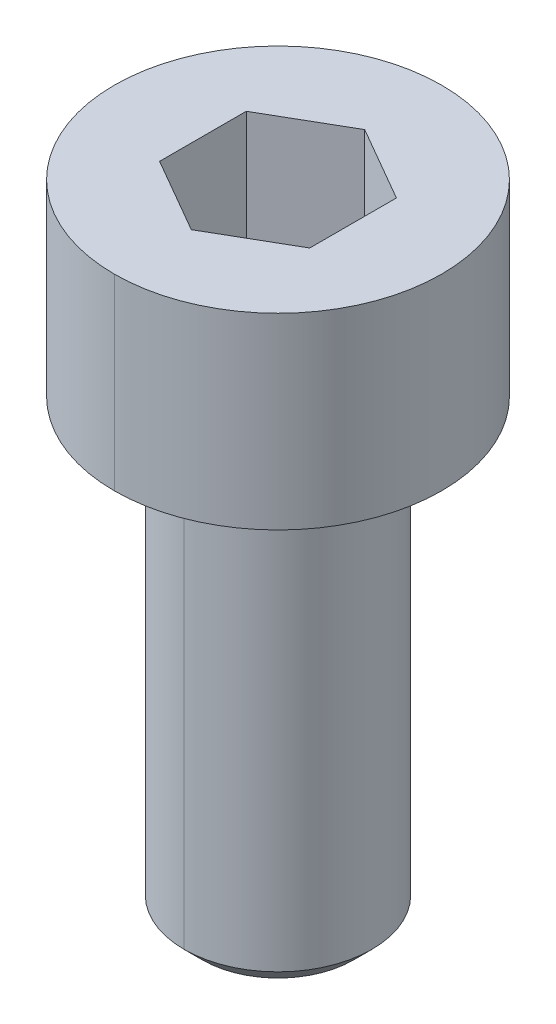
ISO-10303-21;
HEADER;
FILE_DESCRIPTION(('STEP AP214'),'2;1');
FILE_NAME('part.step','',(''),(''),'','','');
FILE_SCHEMA(('AUTOMOTIVE_DESIGN { 1 0 10303 214 1 1 1 1 }'));
ENDSEC;
DATA;
#1=APPLICATION_CONTEXT('core data for automotive mechanical design processes');
#2=APPLICATION_PROTOCOL_DEFINITION('international standard','automotive_design',2000,#1);
#3=PRODUCT_CONTEXT('',#1,'mechanical');
#4=PRODUCT('Part','Part','',(#3));
#5=PRODUCT_RELATED_PRODUCT_CATEGORY('part','',(#4));
#6=PRODUCT_DEFINITION_FORMATION('','',#4);
#7=PRODUCT_DEFINITION_CONTEXT('part definition',#1,'design');
#8=PRODUCT_DEFINITION('design','',#6,#7);
#9=PRODUCT_DEFINITION_SHAPE('','',#8);
#10=(LENGTH_UNIT() NAMED_UNIT(*) SI_UNIT(.MILLI.,.METRE.));
#11=(NAMED_UNIT(*) PLANE_ANGLE_UNIT() SI_UNIT($,.RADIAN.));
#12=(NAMED_UNIT(*) SI_UNIT($,.STERADIAN.) SOLID_ANGLE_UNIT());
#13=UNCERTAINTY_MEASURE_WITH_UNIT(LENGTH_MEASURE(1.E-05),#10,'distance_accuracy_value','');
#14=(GEOMETRIC_REPRESENTATION_CONTEXT(3) GLOBAL_UNCERTAINTY_ASSIGNED_CONTEXT((#13)) GLOBAL_UNIT_ASSIGNED_CONTEXT((#10,
#11,#12)) REPRESENTATION_CONTEXT('',''));
#15=CARTESIAN_POINT('',(0.,0.,0.));
#16=DIRECTION('',(0.,0.,1.));
#17=DIRECTION('',(1.,0.,0.));
#18=AXIS2_PLACEMENT_3D('',#15,#16,#17);
#19=CARTESIAN_POINT('',(0.,5.,0.));
#20=DIRECTION('',(0.,-1.,0.));
#21=DIRECTION('',(0.,0.,-1.));
#22=AXIS2_PLACEMENT_3D('',#19,#20,#21);
#23=PLANE('',#22);
#24=CARTESIAN_POINT('',(0.,5.,0.));
#25=DIRECTION('',(0.,-1.,0.));
#26=DIRECTION('',(0.,0.,-1.));
#27=AXIS2_PLACEMENT_3D('',#24,#25,#26);
#28=CIRCLE('',#27,4.36);
#29=CARTESIAN_POINT('',(0.,5.,-4.36));
#30=VERTEX_POINT('',#29);
#31=CARTESIAN_POINT('',(0.,5.,4.36));
#32=VERTEX_POINT('',#31);
#33=EDGE_CURVE('E11',#30,#32,#28,.T.);
#34=ORIENTED_EDGE('',*,*,#33,.F.);
#35=CARTESIAN_POINT('',(0.,5.,0.));
#36=DIRECTION('',(0.,-1.,0.));
#37=DIRECTION('',(0.,0.,-1.));
#38=AXIS2_PLACEMENT_3D('',#35,#36,#37);
#39=CIRCLE('',#38,4.36);
#40=EDGE_CURVE('E25',#32,#30,#39,.T.);
#41=ORIENTED_EDGE('',*,*,#40,.F.);
#42=EDGE_LOOP('',(#34,#41));
#43=FACE_BOUND('',#42,.T.);
#44=DIRECTION('',(0.866025403784448,0.,-0.499999999999983));
#45=VECTOR('',#44,1.);
#46=CARTESIAN_POINT('',(0.,5.,2.3094010767585));
#47=LINE('',#46,#45);
#48=CARTESIAN_POINT('',(0.,5.,2.3094010767585));
#49=VERTEX_POINT('',#48);
#50=CARTESIAN_POINT('',(2.,5.,1.1547005383793));
#51=VERTEX_POINT('',#50);
#52=EDGE_CURVE('E245',#49,#51,#47,.T.);
#53=ORIENTED_EDGE('',*,*,#52,.F.);
#54=DIRECTION('',(0.866025403784448,0.,0.499999999999983));
#55=VECTOR('',#54,1.);
#56=CARTESIAN_POINT('',(-2.,5.,1.1547005383793));
#57=LINE('',#56,#55);
#58=CARTESIAN_POINT('',(-2.,5.,1.1547005383793));
#59=VERTEX_POINT('',#58);
#60=EDGE_CURVE('E240',#59,#49,#57,.T.);
#61=ORIENTED_EDGE('',*,*,#60,.F.);
#62=DIRECTION('',(0.,0.,1.));
#63=VECTOR('',#62,1.);
#64=CARTESIAN_POINT('',(-2.,5.,-1.1547005383793));
#65=LINE('',#64,#63);
#66=CARTESIAN_POINT('',(-2.,5.,-1.1547005383793));
#67=VERTEX_POINT('',#66);
#68=EDGE_CURVE('E235',#67,#59,#65,.T.);
#69=ORIENTED_EDGE('',*,*,#68,.F.);
#70=DIRECTION('',(-0.866025403784448,0.,0.499999999999983));
#71=VECTOR('',#70,1.);
#72=CARTESIAN_POINT('',(0.,5.,-2.3094010767585));
#73=LINE('',#72,#71);
#74=CARTESIAN_POINT('',(0.,5.,-2.3094010767585));
#75=VERTEX_POINT('',#74);
#76=EDGE_CURVE('E230',#75,#67,#73,.T.);
#77=ORIENTED_EDGE('',*,*,#76,.F.);
#78=DIRECTION('',(-0.866025403784448,0.,-0.499999999999983));
#79=VECTOR('',#78,1.);
#80=CARTESIAN_POINT('',(2.,5.,-1.1547005383793));
#81=LINE('',#80,#79);
#82=CARTESIAN_POINT('',(2.,5.,-1.1547005383793));
#83=VERTEX_POINT('',#82);
#84=EDGE_CURVE('E225',#83,#75,#81,.T.);
#85=ORIENTED_EDGE('',*,*,#84,.F.);
#86=DIRECTION('',(0.,0.,1.));
#87=VECTOR('',#86,1.);
#88=CARTESIAN_POINT('',(2.,5.,0.));
#89=LINE('',#88,#87);
#90=EDGE_CURVE('E221',#83,#51,#89,.T.);
#91=ORIENTED_EDGE('',*,*,#90,.T.);
#92=EDGE_LOOP('',(#53,#61,#69,#77,#85,#91));
#93=FACE_BOUND('',#92,.T.);
#94=ADVANCED_FACE('F17',(#43,#93),#23,.F.);
#95=CARTESIAN_POINT('',(2.,1.,1.1547005383793));
#96=DIRECTION('',(1.,0.,0.));
#97=DIRECTION('',(0.,0.,-1.));
#98=AXIS2_PLACEMENT_3D('',#95,#96,#97);
#99=PLANE('',#98);
#100=DIRECTION('',(0.,1.,0.));
#101=VECTOR('',#100,1.);
#102=CARTESIAN_POINT('',(2.,1.,1.1547005383793));
#103=LINE('',#102,#101);
#104=CARTESIAN_POINT('',(2.,1.,1.1547005383793));
#105=VERTEX_POINT('',#104);
#106=EDGE_CURVE('E216',#105,#51,#103,.T.);
#107=ORIENTED_EDGE('',*,*,#106,.T.);
#108=ORIENTED_EDGE('',*,*,#90,.F.);
#109=DIRECTION('',(0.,1.,0.));
#110=VECTOR('',#109,1.);
#111=CARTESIAN_POINT('',(2.,1.,-1.1547005383793));
#112=LINE('',#111,#110);
#113=CARTESIAN_POINT('',(2.,1.,-1.1547005383793));
#114=VERTEX_POINT('',#113);
#115=EDGE_CURVE('E211',#114,#83,#112,.T.);
#116=ORIENTED_EDGE('',*,*,#115,.F.);
#117=DIRECTION('',(0.,0.,-1.));
#118=VECTOR('',#117,1.);
#119=CARTESIAN_POINT('',(2.,1.,1.1547005383793));
#120=LINE('',#119,#118);
#121=EDGE_CURVE('E206',#105,#114,#120,.T.);
#122=ORIENTED_EDGE('',*,*,#121,.F.);
#123=EDGE_LOOP('',(#107,#108,#116,#122));
#124=FACE_BOUND('',#123,.T.);
#125=ADVANCED_FACE('F276',(#124),#99,.F.);
#126=CARTESIAN_POINT('',(0.,1.,0.));
#127=DIRECTION('',(0.,1.,0.));
#128=DIRECTION('',(0.,0.,1.));
#129=AXIS2_PLACEMENT_3D('',#126,#127,#128);
#130=PLANE('',#129);
#131=DIRECTION('',(0.,0.,1.));
#132=VECTOR('',#131,1.);
#133=CARTESIAN_POINT('',(-2.,1.,-1.1547005383793));
#134=LINE('',#133,#132);
#135=CARTESIAN_POINT('',(-2.,1.,-1.1547005383793));
#136=VERTEX_POINT('',#135);
#137=CARTESIAN_POINT('',(-2.,1.,1.1547005383793));
#138=VERTEX_POINT('',#137);
#139=EDGE_CURVE('E202',#136,#138,#134,.T.);
#140=ORIENTED_EDGE('',*,*,#139,.T.);
#141=DIRECTION('',(0.866025403784448,0.,0.499999999999983));
#142=VECTOR('',#141,1.);
#143=CARTESIAN_POINT('',(-2.,1.,1.1547005383793));
#144=LINE('',#143,#142);
#145=CARTESIAN_POINT('',(0.,1.,2.3094010767585));
#146=VERTEX_POINT('',#145);
#147=EDGE_CURVE('E198',#138,#146,#144,.T.);
#148=ORIENTED_EDGE('',*,*,#147,.T.);
#149=DIRECTION('',(0.866025403784448,0.,-0.499999999999983));
#150=VECTOR('',#149,1.);
#151=CARTESIAN_POINT('',(0.,1.,2.3094010767585));
#152=LINE('',#151,#150);
#153=EDGE_CURVE('E193',#146,#105,#152,.T.);
#154=ORIENTED_EDGE('',*,*,#153,.T.);
#155=ORIENTED_EDGE('',*,*,#121,.T.);
#156=DIRECTION('',(-0.866025403784448,0.,-0.499999999999983));
#157=VECTOR('',#156,1.);
#158=CARTESIAN_POINT('',(2.,1.,-1.1547005383793));
#159=LINE('',#158,#157);
#160=CARTESIAN_POINT('',(0.,1.,-2.3094010767585));
#161=VERTEX_POINT('',#160);
#162=EDGE_CURVE('E189',#114,#161,#159,.T.);
#163=ORIENTED_EDGE('',*,*,#162,.T.);
#164=DIRECTION('',(-0.866025403784448,0.,0.499999999999983));
#165=VECTOR('',#164,1.);
#166=CARTESIAN_POINT('',(0.,1.,-2.3094010767585));
#167=LINE('',#166,#165);
#168=EDGE_CURVE('E185',#161,#136,#167,.T.);
#169=ORIENTED_EDGE('',*,*,#168,.T.);
#170=EDGE_LOOP('',(#140,#148,#154,#155,#163,#169));
#171=FACE_BOUND('',#170,.T.);
#172=ADVANCED_FACE('F280',(#171),#130,.T.);
#173=CARTESIAN_POINT('',(0.,1.,-2.3094010767585));
#174=DIRECTION('',(-0.499999999999983,0.,-0.866025403784448));
#175=DIRECTION('',(-0.866025403784448,0.,0.499999999999983));
#176=AXIS2_PLACEMENT_3D('',#173,#174,#175);
#177=PLANE('',#176);
#178=ORIENTED_EDGE('',*,*,#76,.T.);
#179=DIRECTION('',(0.,1.,0.));
#180=VECTOR('',#179,1.);
#181=CARTESIAN_POINT('',(-2.,1.,-1.1547005383793));
#182=LINE('',#181,#180);
#183=EDGE_CURVE('E180',#136,#67,#182,.T.);
#184=ORIENTED_EDGE('',*,*,#183,.F.);
#185=ORIENTED_EDGE('',*,*,#168,.F.);
#186=DIRECTION('',(0.,1.,0.));
#187=VECTOR('',#186,1.);
#188=CARTESIAN_POINT('',(0.,1.,-2.3094010767585));
#189=LINE('',#188,#187);
#190=EDGE_CURVE('E175',#161,#75,#189,.T.);
#191=ORIENTED_EDGE('',*,*,#190,.T.);
#192=EDGE_LOOP('',(#178,#184,#185,#191));
#193=FACE_BOUND('',#192,.T.);
#194=ADVANCED_FACE('F301',(#193),#177,.F.);
#195=CARTESIAN_POINT('',(2.,1.,-1.1547005383793));
#196=DIRECTION('',(0.499999999999983,0.,-0.866025403784448));
#197=DIRECTION('',(-0.866025403784448,0.,-0.499999999999983));
#198=AXIS2_PLACEMENT_3D('',#195,#196,#197);
#199=PLANE('',#198);
#200=ORIENTED_EDGE('',*,*,#84,.T.);
#201=ORIENTED_EDGE('',*,*,#190,.F.);
#202=ORIENTED_EDGE('',*,*,#162,.F.);
#203=ORIENTED_EDGE('',*,*,#115,.T.);
#204=EDGE_LOOP('',(#200,#201,#202,#203));
#205=FACE_BOUND('',#204,.T.);
#206=ADVANCED_FACE('F304',(#205),#199,.F.);
#207=CARTESIAN_POINT('',(-2.,1.,-1.1547005383793));
#208=DIRECTION('',(-1.,0.,0.));
#209=DIRECTION('',(0.,0.,1.));
#210=AXIS2_PLACEMENT_3D('',#207,#208,#209);
#211=PLANE('',#210);
#212=ORIENTED_EDGE('',*,*,#68,.T.);
#213=DIRECTION('',(0.,1.,0.));
#214=VECTOR('',#213,1.);
#215=CARTESIAN_POINT('',(-2.,1.,1.1547005383793));
#216=LINE('',#215,#214);
#217=EDGE_CURVE('E170',#138,#59,#216,.T.);
#218=ORIENTED_EDGE('',*,*,#217,.F.);
#219=ORIENTED_EDGE('',*,*,#139,.F.);
#220=ORIENTED_EDGE('',*,*,#183,.T.);
#221=EDGE_LOOP('',(#212,#218,#219,#220));
#222=FACE_BOUND('',#221,.T.);
#223=ADVANCED_FACE('F299',(#222),#211,.F.);
#224=CARTESIAN_POINT('',(-2.,1.,1.1547005383793));
#225=DIRECTION('',(-0.499999999999983,0.,0.866025403784448));
#226=DIRECTION('',(0.866025403784448,0.,0.499999999999983));
#227=AXIS2_PLACEMENT_3D('',#224,#225,#226);
#228=PLANE('',#227);
#229=ORIENTED_EDGE('',*,*,#60,.T.);
#230=DIRECTION('',(0.,1.,0.));
#231=VECTOR('',#230,1.);
#232=CARTESIAN_POINT('',(0.,1.,2.3094010767585));
#233=LINE('',#232,#231);
#234=EDGE_CURVE('E165',#146,#49,#233,.T.);
#235=ORIENTED_EDGE('',*,*,#234,.F.);
#236=ORIENTED_EDGE('',*,*,#147,.F.);
#237=ORIENTED_EDGE('',*,*,#217,.T.);
#238=EDGE_LOOP('',(#229,#235,#236,#237));
#239=FACE_BOUND('',#238,.T.);
#240=ADVANCED_FACE('F288',(#239),#228,.F.);
#241=CARTESIAN_POINT('',(0.,1.,2.3094010767585));
#242=DIRECTION('',(0.499999999999983,0.,0.866025403784448));
#243=DIRECTION('',(0.866025403784448,0.,-0.499999999999983));
#244=AXIS2_PLACEMENT_3D('',#241,#242,#243);
#245=PLANE('',#244);
#246=ORIENTED_EDGE('',*,*,#52,.T.);
#247=ORIENTED_EDGE('',*,*,#106,.F.);
#248=ORIENTED_EDGE('',*,*,#153,.F.);
#249=ORIENTED_EDGE('',*,*,#234,.T.);
#250=EDGE_LOOP('',(#246,#247,#248,#249));
#251=FACE_BOUND('',#250,.T.);
#252=ADVANCED_FACE('F292',(#251),#245,.F.);
#253=CARTESIAN_POINT('',(0.,-12.,0.));
#254=DIRECTION('',(0.,1.,0.));
#255=DIRECTION('',(1.,0.,0.));
#256=AXIS2_PLACEMENT_3D('',#253,#254,#255);
#257=CYLINDRICAL_SURFACE('',#256,4.36);
#258=ORIENTED_EDGE('',*,*,#40,.T.);
#259=DIRECTION('',(0.,1.,0.));
#260=VECTOR('',#259,1.);
#261=CARTESIAN_POINT('',(0.,0.,-4.36));
#262=LINE('',#261,#260);
#263=CARTESIAN_POINT('',(0.,0.,-4.36));
#264=VERTEX_POINT('',#263);
#265=EDGE_CURVE('E160',#264,#30,#262,.T.);
#266=ORIENTED_EDGE('',*,*,#265,.F.);
#267=CARTESIAN_POINT('',(0.,0.,0.));
#268=DIRECTION('',(0.,-1.,0.));
#269=DIRECTION('',(0.,0.,-1.));
#270=AXIS2_PLACEMENT_3D('',#267,#268,#269);
#271=CIRCLE('',#270,4.36);
#272=CARTESIAN_POINT('',(0.,0.,4.36));
#273=VERTEX_POINT('',#272);
#274=EDGE_CURVE('E155',#273,#264,#271,.T.);
#275=ORIENTED_EDGE('',*,*,#274,.F.);
#276=DIRECTION('',(0.,1.,0.));
#277=VECTOR('',#276,1.);
#278=CARTESIAN_POINT('',(0.,0.,4.36));
#279=LINE('',#278,#277);
#280=EDGE_CURVE('E151',#273,#32,#279,.T.);
#281=ORIENTED_EDGE('',*,*,#280,.T.);
#282=EDGE_LOOP('',(#258,#266,#275,#281));
#283=FACE_BOUND('',#282,.T.);
#284=ADVANCED_FACE('F255',(#283),#257,.T.);
#285=CARTESIAN_POINT('',(0.,-12.,0.));
#286=DIRECTION('',(0.,1.,0.));
#287=DIRECTION('',(-1.,0.,0.));
#288=AXIS2_PLACEMENT_3D('',#285,#286,#287);
#289=CYLINDRICAL_SURFACE('',#288,4.36);
#290=CARTESIAN_POINT('',(0.,0.,0.));
#291=DIRECTION('',(0.,-1.,0.));
#292=DIRECTION('',(0.,0.,-1.));
#293=AXIS2_PLACEMENT_3D('',#290,#291,#292);
#294=CIRCLE('',#293,4.36);
#295=EDGE_CURVE('E146',#264,#273,#294,.T.);
#296=ORIENTED_EDGE('',*,*,#295,.F.);
#297=ORIENTED_EDGE('',*,*,#265,.T.);
#298=ORIENTED_EDGE('',*,*,#33,.T.);
#299=ORIENTED_EDGE('',*,*,#280,.F.);
#300=EDGE_LOOP('',(#296,#297,#298,#299));
#301=FACE_BOUND('',#300,.T.);
#302=ADVANCED_FACE('F259',(#301),#289,.T.);
#303=CARTESIAN_POINT('',(4.36,0.,0.));
#304=DIRECTION('',(0.,1.,0.));
#305=DIRECTION('',(0.,0.,1.));
#306=AXIS2_PLACEMENT_3D('',#303,#304,#305);
#307=PLANE('',#306);
#308=CARTESIAN_POINT('',(0.,0.,0.));
#309=DIRECTION('',(0.,-1.,0.));
#310=DIRECTION('',(0.,0.,-1.));
#311=AXIS2_PLACEMENT_3D('',#308,#309,#310);
#312=CIRCLE('',#311,2.5);
#313=CARTESIAN_POINT('',(0.,0.,-2.5));
#314=VERTEX_POINT('',#313);
#315=CARTESIAN_POINT('',(0.,0.,2.5));
#316=VERTEX_POINT('',#315);
#317=EDGE_CURVE('E141',#314,#316,#312,.T.);
#318=ORIENTED_EDGE('',*,*,#317,.F.);
#319=CARTESIAN_POINT('',(0.,0.,0.));
#320=DIRECTION('',(0.,-1.,0.));
#321=DIRECTION('',(0.,0.,-1.));
#322=AXIS2_PLACEMENT_3D('',#319,#320,#321);
#323=CIRCLE('',#322,2.5);
#324=EDGE_CURVE('E136',#316,#314,#323,.T.);
#325=ORIENTED_EDGE('',*,*,#324,.F.);
#326=EDGE_LOOP('',(#318,#325));
#327=FACE_BOUND('',#326,.T.);
#328=ORIENTED_EDGE('',*,*,#295,.T.);
#329=ORIENTED_EDGE('',*,*,#274,.T.);
#330=EDGE_LOOP('',(#328,#329));
#331=FACE_BOUND('',#330,.T.);
#332=ADVANCED_FACE('F261',(#327,#331),#307,.F.);
#333=CARTESIAN_POINT('',(0.,-12.,0.));
#334=DIRECTION('',(0.,1.,0.));
#335=DIRECTION('',(1.,0.,0.));
#336=AXIS2_PLACEMENT_3D('',#333,#334,#335);
#337=CYLINDRICAL_SURFACE('',#336,2.5);
#338=ORIENTED_EDGE('',*,*,#324,.T.);
#339=DIRECTION('',(0.,1.,0.));
#340=VECTOR('',#339,1.);
#341=CARTESIAN_POINT('',(0.,-11.5095,-2.5));
#342=LINE('',#341,#340);
#343=CARTESIAN_POINT('',(0.,-11.5095,-2.5));
#344=VERTEX_POINT('',#343);
#345=EDGE_CURVE('E131',#344,#314,#342,.T.);
#346=ORIENTED_EDGE('',*,*,#345,.F.);
#347=CARTESIAN_POINT('',(0.,-11.5095,0.));
#348=DIRECTION('',(0.,-1.,0.));
#349=DIRECTION('',(0.,0.,-1.));
#350=AXIS2_PLACEMENT_3D('',#347,#348,#349);
#351=CIRCLE('',#350,2.5);
#352=CARTESIAN_POINT('',(0.,-11.5095,2.5));
#353=VERTEX_POINT('',#352);
#354=EDGE_CURVE('E127',#353,#344,#351,.T.);
#355=ORIENTED_EDGE('',*,*,#354,.F.);
#356=DIRECTION('',(0.,1.,0.));
#357=VECTOR('',#356,1.);
#358=CARTESIAN_POINT('',(0.,-11.5095,2.5));
#359=LINE('',#358,#357);
#360=EDGE_CURVE('E115',#353,#316,#359,.T.);
#361=ORIENTED_EDGE('',*,*,#360,.T.);
#362=EDGE_LOOP('',(#338,#346,#355,#361));
#363=FACE_BOUND('',#362,.T.);
#364=ADVANCED_FACE('F263',(#363),#337,.T.);
#365=CARTESIAN_POINT('',(0.,-12.,0.));
#366=DIRECTION('',(0.,1.,0.));
#367=DIRECTION('',(-1.,0.,0.));
#368=AXIS2_PLACEMENT_3D('',#365,#366,#367);
#369=CYLINDRICAL_SURFACE('',#368,2.5);
#370=CARTESIAN_POINT('',(0.,-11.5095,0.));
#371=DIRECTION('',(0.,-1.,0.));
#372=DIRECTION('',(0.,0.,-1.));
#373=AXIS2_PLACEMENT_3D('',#370,#371,#372);
#374=CIRCLE('',#373,2.5);
#375=EDGE_CURVE('E103',#344,#353,#374,.T.);
#376=ORIENTED_EDGE('',*,*,#375,.F.);
#377=ORIENTED_EDGE('',*,*,#345,.T.);
#378=ORIENTED_EDGE('',*,*,#317,.T.);
#379=ORIENTED_EDGE('',*,*,#360,.F.);
#380=EDGE_LOOP('',(#376,#377,#378,#379));
#381=FACE_BOUND('',#380,.T.);
#382=ADVANCED_FACE('F271',(#381),#369,.T.);
#383=CARTESIAN_POINT('',(0.,-11.5095,0.));
#384=DIRECTION('',(0.,1.,0.));
#385=DIRECTION('',(-1.,0.,0.));
#386=AXIS2_PLACEMENT_3D('',#383,#384,#385);
#387=CONICAL_SURFACE('',#386,2.5,0.7853981634);
#388=CARTESIAN_POINT('',(0.,-12.,0.));
#389=DIRECTION('',(0.,-1.,0.));
#390=DIRECTION('',(0.,0.,-1.));
#391=AXIS2_PLACEMENT_3D('',#388,#389,#390);
#392=CIRCLE('',#391,2.0095);
#393=CARTESIAN_POINT('',(0.,-12.,-2.0095));
#394=VERTEX_POINT('',#393);
#395=CARTESIAN_POINT('',(0.,-11.9999999999987,2.00949999999875));
#396=VERTEX_POINT('',#395);
#397=EDGE_CURVE('E100',#394,#396,#392,.T.);
#398=ORIENTED_EDGE('',*,*,#397,.F.);
#399=DIRECTION('',(0.,0.707106781184742,-0.707106781188354));
#400=VECTOR('',#399,1.);
#401=CARTESIAN_POINT('',(0.,-11.9999999999987,-2.00949999999875));
#402=LINE('',#401,#400);
#403=EDGE_CURVE('E106',#394,#344,#402,.T.);
#404=ORIENTED_EDGE('',*,*,#403,.T.);
#405=ORIENTED_EDGE('',*,*,#375,.T.);
#406=DIRECTION('',(0.,0.707106781184742,0.707106781188354));
#407=VECTOR('',#406,1.);
#408=CARTESIAN_POINT('',(0.,-11.9999999999987,2.00949999999875));
#409=LINE('',#408,#407);
#410=EDGE_CURVE('E95',#396,#353,#409,.T.);
#411=ORIENTED_EDGE('',*,*,#410,.F.);
#412=EDGE_LOOP('',(#398,#404,#405,#411));
#413=FACE_BOUND('',#412,.T.);
#414=ADVANCED_FACE('F97',(#413),#387,.T.);
#415=CARTESIAN_POINT('',(0.,-11.5095,0.));
#416=DIRECTION('',(0.,1.,0.));
#417=DIRECTION('',(1.,0.,0.));
#418=AXIS2_PLACEMENT_3D('',#415,#416,#417);
#419=CONICAL_SURFACE('',#418,2.5,0.7853981634);
#420=ORIENTED_EDGE('',*,*,#354,.T.);
#421=ORIENTED_EDGE('',*,*,#403,.F.);
#422=CARTESIAN_POINT('',(0.,-12.,0.));
#423=DIRECTION('',(0.,-1.,0.));
#424=DIRECTION('',(0.,0.,-1.));
#425=AXIS2_PLACEMENT_3D('',#422,#423,#424);
#426=CIRCLE('',#425,2.0095);
#427=EDGE_CURVE('E107',#396,#394,#426,.T.);
#428=ORIENTED_EDGE('',*,*,#427,.F.);
#429=ORIENTED_EDGE('',*,*,#410,.T.);
#430=EDGE_LOOP('',(#420,#421,#428,#429));
#431=FACE_BOUND('',#430,.T.);
#432=ADVANCED_FACE('F110',(#431),#419,.T.);
#433=CARTESIAN_POINT('',(2.0095,-12.,0.));
#434=DIRECTION('',(0.,1.,0.));
#435=DIRECTION('',(0.,0.,1.));
#436=AXIS2_PLACEMENT_3D('',#433,#434,#435);
#437=PLANE('',#436);
#438=ORIENTED_EDGE('',*,*,#397,.T.);
#439=ORIENTED_EDGE('',*,*,#427,.T.);
#440=EDGE_LOOP('',(#438,#439));
#441=FACE_BOUND('',#440,.T.);
#442=ADVANCED_FACE('F113',(#441),#437,.F.);
#443=CLOSED_SHELL('',(#94,#125,#172,#194,#206,#223,#240,#252,#284,#302,#332,#364,#382,#414,#432,#442));
#444=MANIFOLD_SOLID_BREP('B1',#443);
#445=ADVANCED_BREP_SHAPE_REPRESENTATION('',(#18,#444),#14);
#446=SHAPE_DEFINITION_REPRESENTATION(#9,#445);
ENDSEC;
END-ISO-10303-21;
